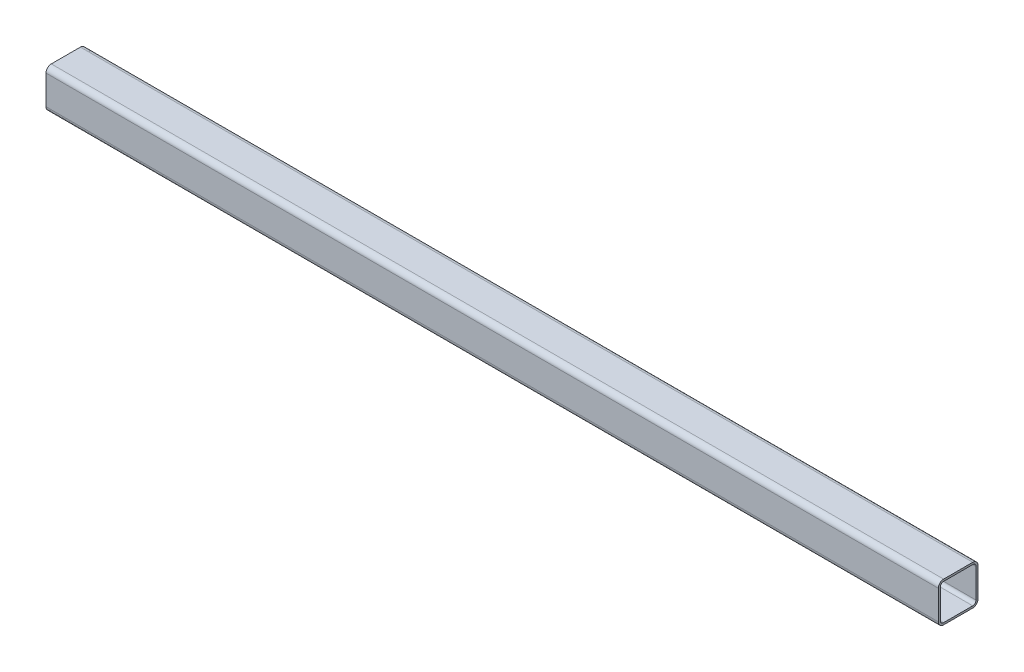
ISO-10303-21;
HEADER;
FILE_DESCRIPTION(('STEP AP214'),'2;1');
FILE_NAME('part.step','',(''),(''),'','','');
FILE_SCHEMA(('AUTOMOTIVE_DESIGN { 1 0 10303 214 1 1 1 1 }'));
ENDSEC;
DATA;
#1=APPLICATION_CONTEXT('core data for automotive mechanical design processes');
#2=APPLICATION_PROTOCOL_DEFINITION('international standard','automotive_design',2000,#1);
#3=PRODUCT_CONTEXT('',#1,'mechanical');
#4=PRODUCT('Part','Part','',(#3));
#5=PRODUCT_RELATED_PRODUCT_CATEGORY('part','',(#4));
#6=PRODUCT_DEFINITION_FORMATION('','',#4);
#7=PRODUCT_DEFINITION_CONTEXT('part definition',#1,'design');
#8=PRODUCT_DEFINITION('design','',#6,#7);
#9=PRODUCT_DEFINITION_SHAPE('','',#8);
#10=(LENGTH_UNIT() NAMED_UNIT(*) SI_UNIT(.MILLI.,.METRE.));
#11=(NAMED_UNIT(*) PLANE_ANGLE_UNIT() SI_UNIT($,.RADIAN.));
#12=(NAMED_UNIT(*) SI_UNIT($,.STERADIAN.) SOLID_ANGLE_UNIT());
#13=UNCERTAINTY_MEASURE_WITH_UNIT(LENGTH_MEASURE(1.E-05),#10,'distance_accuracy_value','');
#14=(GEOMETRIC_REPRESENTATION_CONTEXT(3) GLOBAL_UNCERTAINTY_ASSIGNED_CONTEXT((#13)) GLOBAL_UNIT_ASSIGNED_CONTEXT((#10,
#11,#12)) REPRESENTATION_CONTEXT('',''));
#15=CARTESIAN_POINT('',(0.,0.,0.));
#16=DIRECTION('',(0.,0.,1.));
#17=DIRECTION('',(1.,0.,0.));
#18=AXIS2_PLACEMENT_3D('',#15,#16,#17);
#19=CARTESIAN_POINT('',(-675.,-22.,22.));
#20=DIRECTION('',(1.,0.,0.));
#21=DIRECTION('',(0.,0.,-1.));
#22=AXIS2_PLACEMENT_3D('',#19,#20,#21);
#23=CYLINDRICAL_SURFACE('',#22,8.);
#24=DIRECTION('',(1.,0.,0.));
#25=VECTOR('',#24,1.);
#26=CARTESIAN_POINT('',(-675.,-30.,22.));
#27=LINE('',#26,#25);
#28=CARTESIAN_POINT('',(-675.,-30.,22.));
#29=VERTEX_POINT('',#28);
#30=CARTESIAN_POINT('',(675.,-30.,22.));
#31=VERTEX_POINT('',#30);
#32=EDGE_CURVE('E132',#29,#31,#27,.T.);
#33=ORIENTED_EDGE('',*,*,#32,.T.);
#34=CARTESIAN_POINT('',(675.,-22.,22.));
#35=DIRECTION('',(1.,0.,0.));
#36=DIRECTION('',(0.,0.,-1.));
#37=AXIS2_PLACEMENT_3D('',#34,#35,#36);
#38=CIRCLE('',#37,8.);
#39=CARTESIAN_POINT('',(675.,-22.,30.));
#40=VERTEX_POINT('',#39);
#41=EDGE_CURVE('E285',#40,#31,#38,.T.);
#42=ORIENTED_EDGE('',*,*,#41,.F.);
#43=DIRECTION('',(1.,0.,0.));
#44=VECTOR('',#43,1.);
#45=CARTESIAN_POINT('',(-675.,-22.,30.));
#46=LINE('',#45,#44);
#47=CARTESIAN_POINT('',(-675.,-22.,30.));
#48=VERTEX_POINT('',#47);
#49=EDGE_CURVE('E12',#48,#40,#46,.T.);
#50=ORIENTED_EDGE('',*,*,#49,.F.);
#51=CARTESIAN_POINT('',(-675.,-22.,22.));
#52=DIRECTION('',(1.,0.,0.));
#53=DIRECTION('',(0.,0.,-1.));
#54=AXIS2_PLACEMENT_3D('',#51,#52,#53);
#55=CIRCLE('',#54,8.);
#56=EDGE_CURVE('E328',#48,#29,#55,.T.);
#57=ORIENTED_EDGE('',*,*,#56,.T.);
#58=EDGE_LOOP('',(#33,#42,#50,#57));
#59=FACE_BOUND('',#58,.T.);
#60=ADVANCED_FACE('F129',(#59),#23,.T.);
#61=CARTESIAN_POINT('',(-675.,-22.,30.));
#62=DIRECTION('',(0.,0.,1.));
#63=DIRECTION('',(1.,0.,0.));
#64=AXIS2_PLACEMENT_3D('',#61,#62,#63);
#65=PLANE('',#64);
#66=ORIENTED_EDGE('',*,*,#49,.T.);
#67=DIRECTION('',(0.,-1.,0.));
#68=VECTOR('',#67,1.);
#69=CARTESIAN_POINT('',(675.,-22.,30.));
#70=LINE('',#69,#68);
#71=CARTESIAN_POINT('',(675.,22.,30.));
#72=VERTEX_POINT('',#71);
#73=EDGE_CURVE('E306',#72,#40,#70,.T.);
#74=ORIENTED_EDGE('',*,*,#73,.F.);
#75=DIRECTION('',(1.,0.,0.));
#76=VECTOR('',#75,1.);
#77=CARTESIAN_POINT('',(-675.,22.,30.));
#78=LINE('',#77,#76);
#79=CARTESIAN_POINT('',(-675.,22.,30.));
#80=VERTEX_POINT('',#79);
#81=EDGE_CURVE('E137',#80,#72,#78,.T.);
#82=ORIENTED_EDGE('',*,*,#81,.F.);
#83=DIRECTION('',(0.,-1.,0.));
#84=VECTOR('',#83,1.);
#85=CARTESIAN_POINT('',(-675.,-22.,30.));
#86=LINE('',#85,#84);
#87=EDGE_CURVE('E359',#80,#48,#86,.T.);
#88=ORIENTED_EDGE('',*,*,#87,.T.);
#89=EDGE_LOOP('',(#66,#74,#82,#88));
#90=FACE_BOUND('',#89,.T.);
#91=ADVANCED_FACE('F380',(#90),#65,.T.);
#92=CARTESIAN_POINT('',(-675.,22.,22.));
#93=DIRECTION('',(1.,0.,0.));
#94=DIRECTION('',(0.,0.,-1.));
#95=AXIS2_PLACEMENT_3D('',#92,#93,#94);
#96=CYLINDRICAL_SURFACE('',#95,8.);
#97=ORIENTED_EDGE('',*,*,#81,.T.);
#98=CARTESIAN_POINT('',(675.,22.,22.));
#99=DIRECTION('',(1.,0.,0.));
#100=DIRECTION('',(0.,0.,-1.));
#101=AXIS2_PLACEMENT_3D('',#98,#99,#100);
#102=CIRCLE('',#101,8.);
#103=CARTESIAN_POINT('',(675.,30.,22.));
#104=VERTEX_POINT('',#103);
#105=EDGE_CURVE('E303',#104,#72,#102,.T.);
#106=ORIENTED_EDGE('',*,*,#105,.F.);
#107=DIRECTION('',(1.,0.,0.));
#108=VECTOR('',#107,1.);
#109=CARTESIAN_POINT('',(-675.,30.,22.));
#110=LINE('',#109,#108);
#111=CARTESIAN_POINT('',(-675.,30.,22.));
#112=VERTEX_POINT('',#111);
#113=EDGE_CURVE('E363',#112,#104,#110,.T.);
#114=ORIENTED_EDGE('',*,*,#113,.F.);
#115=CARTESIAN_POINT('',(-675.,22.,22.));
#116=DIRECTION('',(1.,0.,0.));
#117=DIRECTION('',(0.,0.,-1.));
#118=AXIS2_PLACEMENT_3D('',#115,#116,#117);
#119=CIRCLE('',#118,8.);
#120=EDGE_CURVE('E356',#112,#80,#119,.T.);
#121=ORIENTED_EDGE('',*,*,#120,.T.);
#122=EDGE_LOOP('',(#97,#106,#114,#121));
#123=FACE_BOUND('',#122,.T.);
#124=ADVANCED_FACE('F401',(#123),#96,.T.);
#125=CARTESIAN_POINT('',(-675.,30.,22.));
#126=DIRECTION('',(0.,1.,0.));
#127=DIRECTION('',(0.,0.,1.));
#128=AXIS2_PLACEMENT_3D('',#125,#126,#127);
#129=PLANE('',#128);
#130=ORIENTED_EDGE('',*,*,#113,.T.);
#131=DIRECTION('',(0.,0.,1.));
#132=VECTOR('',#131,1.);
#133=CARTESIAN_POINT('',(675.,30.,22.));
#134=LINE('',#133,#132);
#135=CARTESIAN_POINT('',(675.,30.,-22.));
#136=VERTEX_POINT('',#135);
#137=EDGE_CURVE('E300',#136,#104,#134,.T.);
#138=ORIENTED_EDGE('',*,*,#137,.F.);
#139=DIRECTION('',(1.,0.,0.));
#140=VECTOR('',#139,1.);
#141=CARTESIAN_POINT('',(-675.,30.,-22.));
#142=LINE('',#141,#140);
#143=CARTESIAN_POINT('',(-675.,30.,-22.));
#144=VERTEX_POINT('',#143);
#145=EDGE_CURVE('E365',#144,#136,#142,.T.);
#146=ORIENTED_EDGE('',*,*,#145,.F.);
#147=DIRECTION('',(0.,0.,1.));
#148=VECTOR('',#147,1.);
#149=CARTESIAN_POINT('',(-675.,30.,22.));
#150=LINE('',#149,#148);
#151=EDGE_CURVE('E353',#144,#112,#150,.T.);
#152=ORIENTED_EDGE('',*,*,#151,.T.);
#153=EDGE_LOOP('',(#130,#138,#146,#152));
#154=FACE_BOUND('',#153,.T.);
#155=ADVANCED_FACE('F398',(#154),#129,.T.);
#156=CARTESIAN_POINT('',(-675.,22.,-22.));
#157=DIRECTION('',(1.,0.,0.));
#158=DIRECTION('',(0.,0.,-1.));
#159=AXIS2_PLACEMENT_3D('',#156,#157,#158);
#160=CYLINDRICAL_SURFACE('',#159,8.);
#161=ORIENTED_EDGE('',*,*,#145,.T.);
#162=CARTESIAN_POINT('',(675.,22.,-22.));
#163=DIRECTION('',(1.,0.,0.));
#164=DIRECTION('',(0.,0.,-1.));
#165=AXIS2_PLACEMENT_3D('',#162,#163,#164);
#166=CIRCLE('',#165,8.);
#167=CARTESIAN_POINT('',(675.,22.,-30.));
#168=VERTEX_POINT('',#167);
#169=EDGE_CURVE('E297',#168,#136,#166,.T.);
#170=ORIENTED_EDGE('',*,*,#169,.F.);
#171=DIRECTION('',(1.,0.,0.));
#172=VECTOR('',#171,1.);
#173=CARTESIAN_POINT('',(-675.,22.,-30.));
#174=LINE('',#173,#172);
#175=CARTESIAN_POINT('',(-675.,22.,-30.));
#176=VERTEX_POINT('',#175);
#177=EDGE_CURVE('E367',#176,#168,#174,.T.);
#178=ORIENTED_EDGE('',*,*,#177,.F.);
#179=CARTESIAN_POINT('',(-675.,22.,-22.));
#180=DIRECTION('',(1.,0.,0.));
#181=DIRECTION('',(0.,0.,-1.));
#182=AXIS2_PLACEMENT_3D('',#179,#180,#181);
#183=CIRCLE('',#182,8.);
#184=EDGE_CURVE('E350',#176,#144,#183,.T.);
#185=ORIENTED_EDGE('',*,*,#184,.T.);
#186=EDGE_LOOP('',(#161,#170,#178,#185));
#187=FACE_BOUND('',#186,.T.);
#188=ADVANCED_FACE('F396',(#187),#160,.T.);
#189=CARTESIAN_POINT('',(-675.,-22.,-30.));
#190=DIRECTION('',(0.,0.,-1.));
#191=DIRECTION('',(-1.,0.,0.));
#192=AXIS2_PLACEMENT_3D('',#189,#190,#191);
#193=PLANE('',#192);
#194=ORIENTED_EDGE('',*,*,#177,.T.);
#195=DIRECTION('',(0.,1.,0.));
#196=VECTOR('',#195,1.);
#197=CARTESIAN_POINT('',(675.,-22.,-30.));
#198=LINE('',#197,#196);
#199=CARTESIAN_POINT('',(675.,-22.,-30.));
#200=VERTEX_POINT('',#199);
#201=EDGE_CURVE('E294',#200,#168,#198,.T.);
#202=ORIENTED_EDGE('',*,*,#201,.F.);
#203=DIRECTION('',(1.,0.,0.));
#204=VECTOR('',#203,1.);
#205=CARTESIAN_POINT('',(-675.,-22.,-30.));
#206=LINE('',#205,#204);
#207=CARTESIAN_POINT('',(-675.,-22.,-30.));
#208=VERTEX_POINT('',#207);
#209=EDGE_CURVE('E369',#208,#200,#206,.T.);
#210=ORIENTED_EDGE('',*,*,#209,.F.);
#211=DIRECTION('',(0.,1.,0.));
#212=VECTOR('',#211,1.);
#213=CARTESIAN_POINT('',(-675.,-22.,-30.));
#214=LINE('',#213,#212);
#215=EDGE_CURVE('E347',#208,#176,#214,.T.);
#216=ORIENTED_EDGE('',*,*,#215,.T.);
#217=EDGE_LOOP('',(#194,#202,#210,#216));
#218=FACE_BOUND('',#217,.T.);
#219=ADVANCED_FACE('F394',(#218),#193,.T.);
#220=CARTESIAN_POINT('',(-675.,-22.,-22.));
#221=DIRECTION('',(1.,0.,0.));
#222=DIRECTION('',(0.,0.,-1.));
#223=AXIS2_PLACEMENT_3D('',#220,#221,#222);
#224=CYLINDRICAL_SURFACE('',#223,8.);
#225=ORIENTED_EDGE('',*,*,#209,.T.);
#226=CARTESIAN_POINT('',(675.,-22.,-22.));
#227=DIRECTION('',(1.,0.,0.));
#228=DIRECTION('',(0.,0.,-1.));
#229=AXIS2_PLACEMENT_3D('',#226,#227,#228);
#230=CIRCLE('',#229,8.);
#231=CARTESIAN_POINT('',(675.,-30.,-22.));
#232=VERTEX_POINT('',#231);
#233=EDGE_CURVE('E291',#232,#200,#230,.T.);
#234=ORIENTED_EDGE('',*,*,#233,.F.);
#235=DIRECTION('',(1.,0.,0.));
#236=VECTOR('',#235,1.);
#237=CARTESIAN_POINT('',(-675.,-30.,-22.));
#238=LINE('',#237,#236);
#239=CARTESIAN_POINT('',(-675.,-30.,-22.));
#240=VERTEX_POINT('',#239);
#241=EDGE_CURVE('E370',#240,#232,#238,.T.);
#242=ORIENTED_EDGE('',*,*,#241,.F.);
#243=CARTESIAN_POINT('',(-675.,-22.,-22.));
#244=DIRECTION('',(1.,0.,0.));
#245=DIRECTION('',(0.,0.,-1.));
#246=AXIS2_PLACEMENT_3D('',#243,#244,#245);
#247=CIRCLE('',#246,8.);
#248=EDGE_CURVE('E344',#240,#208,#247,.T.);
#249=ORIENTED_EDGE('',*,*,#248,.T.);
#250=EDGE_LOOP('',(#225,#234,#242,#249));
#251=FACE_BOUND('',#250,.T.);
#252=ADVANCED_FACE('F390',(#251),#224,.T.);
#253=CARTESIAN_POINT('',(-675.,-30.,22.));
#254=DIRECTION('',(0.,-1.,0.));
#255=DIRECTION('',(0.,0.,-1.));
#256=AXIS2_PLACEMENT_3D('',#253,#254,#255);
#257=PLANE('',#256);
#258=ORIENTED_EDGE('',*,*,#241,.T.);
#259=DIRECTION('',(0.,0.,-1.));
#260=VECTOR('',#259,1.);
#261=CARTESIAN_POINT('',(675.,-30.,22.));
#262=LINE('',#261,#260);
#263=EDGE_CURVE('E288',#31,#232,#262,.T.);
#264=ORIENTED_EDGE('',*,*,#263,.F.);
#265=ORIENTED_EDGE('',*,*,#32,.F.);
#266=DIRECTION('',(0.,0.,-1.));
#267=VECTOR('',#266,1.);
#268=CARTESIAN_POINT('',(-675.,-30.,22.));
#269=LINE('',#268,#267);
#270=EDGE_CURVE('E341',#29,#240,#269,.T.);
#271=ORIENTED_EDGE('',*,*,#270,.T.);
#272=EDGE_LOOP('',(#258,#264,#265,#271));
#273=FACE_BOUND('',#272,.T.);
#274=ADVANCED_FACE('F374',(#273),#257,.T.);
#275=CARTESIAN_POINT('',(-675.,-22.,22.));
#276=DIRECTION('',(1.,0.,0.));
#277=DIRECTION('',(0.,0.,-1.));
#278=AXIS2_PLACEMENT_3D('',#275,#276,#277);
#279=PLANE('',#278);
#280=DIRECTION('',(0.,-1.,0.));
#281=VECTOR('',#280,1.);
#282=CARTESIAN_POINT('',(-675.,-22.,27.));
#283=LINE('',#282,#281);
#284=CARTESIAN_POINT('',(-675.,22.,27.));
#285=VERTEX_POINT('',#284);
#286=CARTESIAN_POINT('',(-675.,-22.,27.));
#287=VERTEX_POINT('',#286);
#288=EDGE_CURVE('E254',#285,#287,#283,.T.);
#289=ORIENTED_EDGE('',*,*,#288,.T.);
#290=CARTESIAN_POINT('',(-675.,-22.,22.));
#291=DIRECTION('',(1.,0.,0.));
#292=DIRECTION('',(0.,0.,-1.));
#293=AXIS2_PLACEMENT_3D('',#290,#291,#292);
#294=CIRCLE('',#293,5.);
#295=CARTESIAN_POINT('',(-675.,-27.,22.));
#296=VERTEX_POINT('',#295);
#297=EDGE_CURVE('E309',#287,#296,#294,.T.);
#298=ORIENTED_EDGE('',*,*,#297,.T.);
#299=DIRECTION('',(0.,0.,-1.));
#300=VECTOR('',#299,1.);
#301=CARTESIAN_POINT('',(-675.,-27.,22.));
#302=LINE('',#301,#300);
#303=CARTESIAN_POINT('',(-675.,-27.,-22.));
#304=VERTEX_POINT('',#303);
#305=EDGE_CURVE('E249',#296,#304,#302,.T.);
#306=ORIENTED_EDGE('',*,*,#305,.T.);
#307=CARTESIAN_POINT('',(-675.,-22.,-22.));
#308=DIRECTION('',(1.,0.,0.));
#309=DIRECTION('',(0.,0.,-1.));
#310=AXIS2_PLACEMENT_3D('',#307,#308,#309);
#311=CIRCLE('',#310,5.);
#312=CARTESIAN_POINT('',(-675.,-22.,-27.));
#313=VERTEX_POINT('',#312);
#314=EDGE_CURVE('E145',#304,#313,#311,.T.);
#315=ORIENTED_EDGE('',*,*,#314,.T.);
#316=DIRECTION('',(0.,1.,0.));
#317=VECTOR('',#316,1.);
#318=CARTESIAN_POINT('',(-675.,-22.,-27.));
#319=LINE('',#318,#317);
#320=CARTESIAN_POINT('',(-675.,22.,-27.));
#321=VERTEX_POINT('',#320);
#322=EDGE_CURVE('E313',#313,#321,#319,.T.);
#323=ORIENTED_EDGE('',*,*,#322,.T.);
#324=CARTESIAN_POINT('',(-675.,22.,-22.));
#325=DIRECTION('',(1.,0.,0.));
#326=DIRECTION('',(0.,0.,-1.));
#327=AXIS2_PLACEMENT_3D('',#324,#325,#326);
#328=CIRCLE('',#327,5.);
#329=CARTESIAN_POINT('',(-675.,27.,-22.));
#330=VERTEX_POINT('',#329);
#331=EDGE_CURVE('E316',#321,#330,#328,.T.);
#332=ORIENTED_EDGE('',*,*,#331,.T.);
#333=DIRECTION('',(0.,0.,1.));
#334=VECTOR('',#333,1.);
#335=CARTESIAN_POINT('',(-675.,27.,22.));
#336=LINE('',#335,#334);
#337=CARTESIAN_POINT('',(-675.,27.,22.));
#338=VERTEX_POINT('',#337);
#339=EDGE_CURVE('E319',#330,#338,#336,.T.);
#340=ORIENTED_EDGE('',*,*,#339,.T.);
#341=CARTESIAN_POINT('',(-675.,22.,22.));
#342=DIRECTION('',(1.,0.,0.));
#343=DIRECTION('',(0.,0.,-1.));
#344=AXIS2_PLACEMENT_3D('',#341,#342,#343);
#345=CIRCLE('',#344,5.);
#346=EDGE_CURVE('E322',#338,#285,#345,.T.);
#347=ORIENTED_EDGE('',*,*,#346,.T.);
#348=EDGE_LOOP('',(#289,#298,#306,#315,#323,#332,#340,#347));
#349=FACE_BOUND('',#348,.T.);
#350=ORIENTED_EDGE('',*,*,#56,.F.);
#351=ORIENTED_EDGE('',*,*,#87,.F.);
#352=ORIENTED_EDGE('',*,*,#120,.F.);
#353=ORIENTED_EDGE('',*,*,#151,.F.);
#354=ORIENTED_EDGE('',*,*,#184,.F.);
#355=ORIENTED_EDGE('',*,*,#215,.F.);
#356=ORIENTED_EDGE('',*,*,#248,.F.);
#357=ORIENTED_EDGE('',*,*,#270,.F.);
#358=EDGE_LOOP('',(#350,#351,#352,#353,#354,#355,#356,#357));
#359=FACE_BOUND('',#358,.T.);
#360=ADVANCED_FACE('F384',(#349,#359),#279,.F.);
#361=CARTESIAN_POINT('',(-675.,-22.,22.));
#362=DIRECTION('',(1.,0.,0.));
#363=DIRECTION('',(0.,0.,-1.));
#364=AXIS2_PLACEMENT_3D('',#361,#362,#363);
#365=CYLINDRICAL_SURFACE('',#364,5.);
#366=DIRECTION('',(1.,0.,0.));
#367=VECTOR('',#366,1.);
#368=CARTESIAN_POINT('',(-675.,-22.,27.));
#369=LINE('',#368,#367);
#370=CARTESIAN_POINT('',(675.,-22.,27.));
#371=VERTEX_POINT('',#370);
#372=EDGE_CURVE('E259',#287,#371,#369,.T.);
#373=ORIENTED_EDGE('',*,*,#372,.T.);
#374=CARTESIAN_POINT('',(675.,-22.,22.));
#375=DIRECTION('',(1.,0.,0.));
#376=DIRECTION('',(0.,0.,-1.));
#377=AXIS2_PLACEMENT_3D('',#374,#375,#376);
#378=CIRCLE('',#377,5.);
#379=CARTESIAN_POINT('',(675.,-27.,22.));
#380=VERTEX_POINT('',#379);
#381=EDGE_CURVE('E257',#371,#380,#378,.T.);
#382=ORIENTED_EDGE('',*,*,#381,.T.);
#383=DIRECTION('',(1.,0.,0.));
#384=VECTOR('',#383,1.);
#385=CARTESIAN_POINT('',(-675.,-27.,22.));
#386=LINE('',#385,#384);
#387=EDGE_CURVE('E242',#296,#380,#386,.T.);
#388=ORIENTED_EDGE('',*,*,#387,.F.);
#389=ORIENTED_EDGE('',*,*,#297,.F.);
#390=EDGE_LOOP('',(#373,#382,#388,#389));
#391=FACE_BOUND('',#390,.T.);
#392=ADVANCED_FACE('F258',(#391),#365,.F.);
#393=CARTESIAN_POINT('',(-675.,-22.,27.));
#394=DIRECTION('',(0.,0.,1.));
#395=DIRECTION('',(1.,0.,0.));
#396=AXIS2_PLACEMENT_3D('',#393,#394,#395);
#397=PLANE('',#396);
#398=DIRECTION('',(1.,0.,0.));
#399=VECTOR('',#398,1.);
#400=CARTESIAN_POINT('',(-675.,22.,27.));
#401=LINE('',#400,#399);
#402=CARTESIAN_POINT('',(675.,22.,27.));
#403=VERTEX_POINT('',#402);
#404=EDGE_CURVE('E329',#285,#403,#401,.T.);
#405=ORIENTED_EDGE('',*,*,#404,.T.);
#406=DIRECTION('',(0.,-1.,0.));
#407=VECTOR('',#406,1.);
#408=CARTESIAN_POINT('',(675.,-22.,27.));
#409=LINE('',#408,#407);
#410=EDGE_CURVE('E283',#403,#371,#409,.T.);
#411=ORIENTED_EDGE('',*,*,#410,.T.);
#412=ORIENTED_EDGE('',*,*,#372,.F.);
#413=ORIENTED_EDGE('',*,*,#288,.F.);
#414=EDGE_LOOP('',(#405,#411,#412,#413));
#415=FACE_BOUND('',#414,.T.);
#416=ADVANCED_FACE('F476',(#415),#397,.F.);
#417=CARTESIAN_POINT('',(-675.,22.,22.));
#418=DIRECTION('',(1.,0.,0.));
#419=DIRECTION('',(0.,0.,-1.));
#420=AXIS2_PLACEMENT_3D('',#417,#418,#419);
#421=CYLINDRICAL_SURFACE('',#420,5.);
#422=DIRECTION('',(1.,0.,0.));
#423=VECTOR('',#422,1.);
#424=CARTESIAN_POINT('',(-675.,27.,22.));
#425=LINE('',#424,#423);
#426=CARTESIAN_POINT('',(675.,27.,22.));
#427=VERTEX_POINT('',#426);
#428=EDGE_CURVE('E331',#338,#427,#425,.T.);
#429=ORIENTED_EDGE('',*,*,#428,.T.);
#430=CARTESIAN_POINT('',(675.,22.,22.));
#431=DIRECTION('',(1.,0.,0.));
#432=DIRECTION('',(0.,0.,-1.));
#433=AXIS2_PLACEMENT_3D('',#430,#431,#432);
#434=CIRCLE('',#433,5.);
#435=EDGE_CURVE('E280',#427,#403,#434,.T.);
#436=ORIENTED_EDGE('',*,*,#435,.T.);
#437=ORIENTED_EDGE('',*,*,#404,.F.);
#438=ORIENTED_EDGE('',*,*,#346,.F.);
#439=EDGE_LOOP('',(#429,#436,#437,#438));
#440=FACE_BOUND('',#439,.T.);
#441=ADVANCED_FACE('F485',(#440),#421,.F.);
#442=CARTESIAN_POINT('',(-675.,27.,22.));
#443=DIRECTION('',(0.,1.,0.));
#444=DIRECTION('',(0.,0.,1.));
#445=AXIS2_PLACEMENT_3D('',#442,#443,#444);
#446=PLANE('',#445);
#447=DIRECTION('',(1.,0.,0.));
#448=VECTOR('',#447,1.);
#449=CARTESIAN_POINT('',(-675.,27.,-22.));
#450=LINE('',#449,#448);
#451=CARTESIAN_POINT('',(675.,27.,-22.));
#452=VERTEX_POINT('',#451);
#453=EDGE_CURVE('E333',#330,#452,#450,.T.);
#454=ORIENTED_EDGE('',*,*,#453,.T.);
#455=DIRECTION('',(0.,0.,1.));
#456=VECTOR('',#455,1.);
#457=CARTESIAN_POINT('',(675.,27.,22.));
#458=LINE('',#457,#456);
#459=EDGE_CURVE('E277',#452,#427,#458,.T.);
#460=ORIENTED_EDGE('',*,*,#459,.T.);
#461=ORIENTED_EDGE('',*,*,#428,.F.);
#462=ORIENTED_EDGE('',*,*,#339,.F.);
#463=EDGE_LOOP('',(#454,#460,#461,#462));
#464=FACE_BOUND('',#463,.T.);
#465=ADVANCED_FACE('F495',(#464),#446,.F.);
#466=CARTESIAN_POINT('',(-675.,22.,-22.));
#467=DIRECTION('',(1.,0.,0.));
#468=DIRECTION('',(0.,0.,-1.));
#469=AXIS2_PLACEMENT_3D('',#466,#467,#468);
#470=CYLINDRICAL_SURFACE('',#469,5.);
#471=DIRECTION('',(1.,0.,0.));
#472=VECTOR('',#471,1.);
#473=CARTESIAN_POINT('',(-675.,22.,-27.));
#474=LINE('',#473,#472);
#475=CARTESIAN_POINT('',(675.,22.,-27.));
#476=VERTEX_POINT('',#475);
#477=EDGE_CURVE('E335',#321,#476,#474,.T.);
#478=ORIENTED_EDGE('',*,*,#477,.T.);
#479=CARTESIAN_POINT('',(675.,22.,-22.));
#480=DIRECTION('',(1.,0.,0.));
#481=DIRECTION('',(0.,0.,-1.));
#482=AXIS2_PLACEMENT_3D('',#479,#480,#481);
#483=CIRCLE('',#482,5.);
#484=EDGE_CURVE('E274',#476,#452,#483,.T.);
#485=ORIENTED_EDGE('',*,*,#484,.T.);
#486=ORIENTED_EDGE('',*,*,#453,.F.);
#487=ORIENTED_EDGE('',*,*,#331,.F.);
#488=EDGE_LOOP('',(#478,#485,#486,#487));
#489=FACE_BOUND('',#488,.T.);
#490=ADVANCED_FACE('F505',(#489),#470,.F.);
#491=CARTESIAN_POINT('',(-675.,-22.,-27.));
#492=DIRECTION('',(0.,0.,-1.));
#493=DIRECTION('',(-1.,0.,0.));
#494=AXIS2_PLACEMENT_3D('',#491,#492,#493);
#495=PLANE('',#494);
#496=DIRECTION('',(1.,0.,0.));
#497=VECTOR('',#496,1.);
#498=CARTESIAN_POINT('',(-675.,-22.,-27.));
#499=LINE('',#498,#497);
#500=CARTESIAN_POINT('',(675.,-22.,-27.));
#501=VERTEX_POINT('',#500);
#502=EDGE_CURVE('E337',#313,#501,#499,.T.);
#503=ORIENTED_EDGE('',*,*,#502,.T.);
#504=DIRECTION('',(0.,1.,0.));
#505=VECTOR('',#504,1.);
#506=CARTESIAN_POINT('',(675.,-22.,-27.));
#507=LINE('',#506,#505);
#508=EDGE_CURVE('E269',#501,#476,#507,.T.);
#509=ORIENTED_EDGE('',*,*,#508,.T.);
#510=ORIENTED_EDGE('',*,*,#477,.F.);
#511=ORIENTED_EDGE('',*,*,#322,.F.);
#512=EDGE_LOOP('',(#503,#509,#510,#511));
#513=FACE_BOUND('',#512,.T.);
#514=ADVANCED_FACE('F515',(#513),#495,.F.);
#515=CARTESIAN_POINT('',(-675.,-22.,-22.));
#516=DIRECTION('',(1.,0.,0.));
#517=DIRECTION('',(0.,0.,-1.));
#518=AXIS2_PLACEMENT_3D('',#515,#516,#517);
#519=CYLINDRICAL_SURFACE('',#518,5.);
#520=DIRECTION('',(1.,0.,0.));
#521=VECTOR('',#520,1.);
#522=CARTESIAN_POINT('',(-675.,-27.,-22.));
#523=LINE('',#522,#521);
#524=CARTESIAN_POINT('',(675.,-27.,-22.));
#525=VERTEX_POINT('',#524);
#526=EDGE_CURVE('E253',#304,#525,#523,.T.);
#527=ORIENTED_EDGE('',*,*,#526,.T.);
#528=CARTESIAN_POINT('',(675.,-22.,-22.));
#529=DIRECTION('',(1.,0.,0.));
#530=DIRECTION('',(0.,0.,-1.));
#531=AXIS2_PLACEMENT_3D('',#528,#529,#530);
#532=CIRCLE('',#531,5.);
#533=EDGE_CURVE('E267',#525,#501,#532,.T.);
#534=ORIENTED_EDGE('',*,*,#533,.T.);
#535=ORIENTED_EDGE('',*,*,#502,.F.);
#536=ORIENTED_EDGE('',*,*,#314,.F.);
#537=EDGE_LOOP('',(#527,#534,#535,#536));
#538=FACE_BOUND('',#537,.T.);
#539=ADVANCED_FACE('F525',(#538),#519,.F.);
#540=CARTESIAN_POINT('',(-675.,-27.,22.));
#541=DIRECTION('',(0.,-1.,0.));
#542=DIRECTION('',(0.,0.,-1.));
#543=AXIS2_PLACEMENT_3D('',#540,#541,#542);
#544=PLANE('',#543);
#545=ORIENTED_EDGE('',*,*,#387,.T.);
#546=DIRECTION('',(0.,0.,-1.));
#547=VECTOR('',#546,1.);
#548=CARTESIAN_POINT('',(675.,-27.,22.));
#549=LINE('',#548,#547);
#550=EDGE_CURVE('E246',#380,#525,#549,.T.);
#551=ORIENTED_EDGE('',*,*,#550,.T.);
#552=ORIENTED_EDGE('',*,*,#526,.F.);
#553=ORIENTED_EDGE('',*,*,#305,.F.);
#554=EDGE_LOOP('',(#545,#551,#552,#553));
#555=FACE_BOUND('',#554,.T.);
#556=ADVANCED_FACE('F244',(#555),#544,.F.);
#557=CARTESIAN_POINT('',(675.,-22.,22.));
#558=DIRECTION('',(1.,0.,0.));
#559=DIRECTION('',(0.,0.,-1.));
#560=AXIS2_PLACEMENT_3D('',#557,#558,#559);
#561=PLANE('',#560);
#562=ORIENTED_EDGE('',*,*,#41,.T.);
#563=ORIENTED_EDGE('',*,*,#263,.T.);
#564=ORIENTED_EDGE('',*,*,#233,.T.);
#565=ORIENTED_EDGE('',*,*,#201,.T.);
#566=ORIENTED_EDGE('',*,*,#169,.T.);
#567=ORIENTED_EDGE('',*,*,#137,.T.);
#568=ORIENTED_EDGE('',*,*,#105,.T.);
#569=ORIENTED_EDGE('',*,*,#73,.T.);
#570=EDGE_LOOP('',(#562,#563,#564,#565,#566,#567,#568,#569));
#571=FACE_BOUND('',#570,.T.);
#572=ORIENTED_EDGE('',*,*,#550,.F.);
#573=ORIENTED_EDGE('',*,*,#381,.F.);
#574=ORIENTED_EDGE('',*,*,#410,.F.);
#575=ORIENTED_EDGE('',*,*,#435,.F.);
#576=ORIENTED_EDGE('',*,*,#459,.F.);
#577=ORIENTED_EDGE('',*,*,#484,.F.);
#578=ORIENTED_EDGE('',*,*,#508,.F.);
#579=ORIENTED_EDGE('',*,*,#533,.F.);
#580=EDGE_LOOP('',(#572,#573,#574,#575,#576,#577,#578,#579));
#581=FACE_BOUND('',#580,.T.);
#582=ADVANCED_FACE('F264',(#571,#581),#561,.T.);
#583=CLOSED_SHELL('',(#60,#91,#124,#155,#188,#219,#252,#274,#360,#392,#416,#441,#465,#490,#514,
#539,#556,#582));
#584=MANIFOLD_SOLID_BREP('B2',#583);
#585=ADVANCED_BREP_SHAPE_REPRESENTATION('',(#18,#584),#14);
#586=SHAPE_DEFINITION_REPRESENTATION(#9,#585);
ENDSEC;
END-ISO-10303-21;
